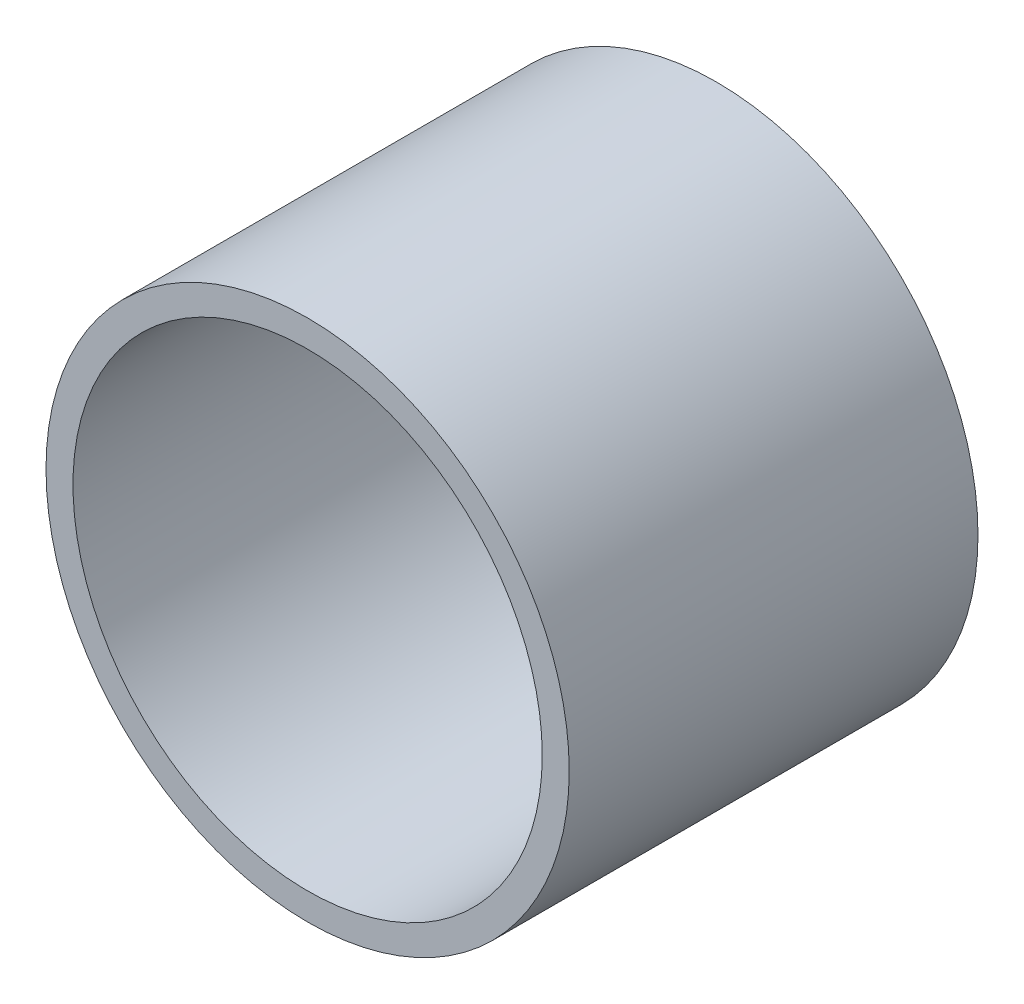
ISO-10303-21;
HEADER;
FILE_DESCRIPTION(('STEP AP214'),'2;1');
FILE_NAME('part.step','',(''),(''),'','','');
FILE_SCHEMA(('AUTOMOTIVE_DESIGN { 1 0 10303 214 1 1 1 1 }'));
ENDSEC;
DATA;
#1=APPLICATION_CONTEXT('core data for automotive mechanical design processes');
#2=APPLICATION_PROTOCOL_DEFINITION('international standard','automotive_design',2000,#1);
#3=PRODUCT_CONTEXT('',#1,'mechanical');
#4=PRODUCT('Part','Part','',(#3));
#5=PRODUCT_RELATED_PRODUCT_CATEGORY('part','',(#4));
#6=PRODUCT_DEFINITION_FORMATION('','',#4);
#7=PRODUCT_DEFINITION_CONTEXT('part definition',#1,'design');
#8=PRODUCT_DEFINITION('design','',#6,#7);
#9=PRODUCT_DEFINITION_SHAPE('','',#8);
#10=(LENGTH_UNIT() NAMED_UNIT(*) SI_UNIT(.MILLI.,.METRE.));
#11=(NAMED_UNIT(*) PLANE_ANGLE_UNIT() SI_UNIT($,.RADIAN.));
#12=(NAMED_UNIT(*) SI_UNIT($,.STERADIAN.) SOLID_ANGLE_UNIT());
#13=UNCERTAINTY_MEASURE_WITH_UNIT(LENGTH_MEASURE(1.E-05),#10,'distance_accuracy_value','');
#14=(GEOMETRIC_REPRESENTATION_CONTEXT(3) GLOBAL_UNCERTAINTY_ASSIGNED_CONTEXT((#13)) GLOBAL_UNIT_ASSIGNED_CONTEXT((#10,
#11,#12)) REPRESENTATION_CONTEXT('',''));
#15=CARTESIAN_POINT('',(0.,0.,0.));
#16=DIRECTION('',(0.,0.,1.));
#17=DIRECTION('',(1.,0.,0.));
#18=AXIS2_PLACEMENT_3D('',#15,#16,#17);
#19=CARTESIAN_POINT('',(0.,0.,50.));
#20=DIRECTION('',(0.,0.,1.));
#21=DIRECTION('',(1.,0.,0.));
#22=AXIS2_PLACEMENT_3D('',#19,#20,#21);
#23=PLANE('',#22);
#24=CARTESIAN_POINT('',(0.,0.,50.));
#25=DIRECTION('',(0.,0.,1.));
#26=DIRECTION('',(1.,0.,0.));
#27=AXIS2_PLACEMENT_3D('',#24,#25,#26);
#28=CIRCLE('',#27,32.);
#29=CARTESIAN_POINT('',(32.,0.,50.));
#30=VERTEX_POINT('',#29);
#31=EDGE_CURVE('E10',#30,#30,#28,.T.);
#32=ORIENTED_EDGE('',*,*,#31,.T.);
#33=EDGE_LOOP('',(#32));
#34=FACE_BOUND('',#33,.T.);
#35=CARTESIAN_POINT('',(0.,0.,50.));
#36=DIRECTION('',(0.,0.,1.));
#37=DIRECTION('',(1.,0.,0.));
#38=AXIS2_PLACEMENT_3D('',#35,#36,#37);
#39=CIRCLE('',#38,28.7);
#40=CARTESIAN_POINT('',(28.7,0.,50.));
#41=VERTEX_POINT('',#40);
#42=EDGE_CURVE('E46',#41,#41,#39,.T.);
#43=ORIENTED_EDGE('',*,*,#42,.F.);
#44=EDGE_LOOP('',(#43));
#45=FACE_BOUND('',#44,.T.);
#46=ADVANCED_FACE('F35',(#34,#45),#23,.T.);
#47=CARTESIAN_POINT('',(0.,0.,0.));
#48=DIRECTION('',(0.,0.,1.));
#49=DIRECTION('',(1.,0.,0.));
#50=AXIS2_PLACEMENT_3D('',#47,#48,#49);
#51=PLANE('',#50);
#52=CARTESIAN_POINT('',(0.,0.,0.));
#53=DIRECTION('',(0.,0.,1.));
#54=DIRECTION('',(1.,0.,0.));
#55=AXIS2_PLACEMENT_3D('',#52,#53,#54);
#56=CIRCLE('',#55,32.);
#57=CARTESIAN_POINT('',(32.,0.,0.));
#58=VERTEX_POINT('',#57);
#59=EDGE_CURVE('E39',#58,#58,#56,.T.);
#60=ORIENTED_EDGE('',*,*,#59,.F.);
#61=EDGE_LOOP('',(#60));
#62=FACE_BOUND('',#61,.T.);
#63=CARTESIAN_POINT('',(0.,0.,0.));
#64=DIRECTION('',(0.,0.,1.));
#65=DIRECTION('',(1.,0.,0.));
#66=AXIS2_PLACEMENT_3D('',#63,#64,#65);
#67=CIRCLE('',#66,28.7);
#68=CARTESIAN_POINT('',(28.7,0.,0.));
#69=VERTEX_POINT('',#68);
#70=EDGE_CURVE('E48',#69,#69,#67,.T.);
#71=ORIENTED_EDGE('',*,*,#70,.T.);
#72=EDGE_LOOP('',(#71));
#73=FACE_BOUND('',#72,.T.);
#74=ADVANCED_FACE('F58',(#62,#73),#51,.F.);
#75=CARTESIAN_POINT('',(0.,0.,50.));
#76=DIRECTION('',(0.,0.,-1.));
#77=DIRECTION('',(-1.,0.,0.));
#78=AXIS2_PLACEMENT_3D('',#75,#76,#77);
#79=CYLINDRICAL_SURFACE('',#78,32.);
#80=ORIENTED_EDGE('',*,*,#31,.F.);
#81=EDGE_LOOP('',(#80));
#82=FACE_BOUND('',#81,.T.);
#83=ORIENTED_EDGE('',*,*,#59,.T.);
#84=EDGE_LOOP('',(#83));
#85=FACE_BOUND('',#84,.T.);
#86=ADVANCED_FACE('F37',(#82,#85),#79,.T.);
#87=CARTESIAN_POINT('',(0.,0.,50.));
#88=DIRECTION('',(0.,0.,-1.));
#89=DIRECTION('',(-1.,0.,0.));
#90=AXIS2_PLACEMENT_3D('',#87,#88,#89);
#91=CYLINDRICAL_SURFACE('',#90,28.7);
#92=ORIENTED_EDGE('',*,*,#42,.T.);
#93=EDGE_LOOP('',(#92));
#94=FACE_BOUND('',#93,.T.);
#95=ORIENTED_EDGE('',*,*,#70,.F.);
#96=EDGE_LOOP('',(#95));
#97=FACE_BOUND('',#96,.T.);
#98=ADVANCED_FACE('F54',(#94,#97),#91,.F.);
#99=CLOSED_SHELL('',(#46,#74,#86,#98));
#100=MANIFOLD_SOLID_BREP('B2',#99);
#101=ADVANCED_BREP_SHAPE_REPRESENTATION('',(#18,#100),#14);
#102=SHAPE_DEFINITION_REPRESENTATION(#9,#101);
ENDSEC;
END-ISO-10303-21;
